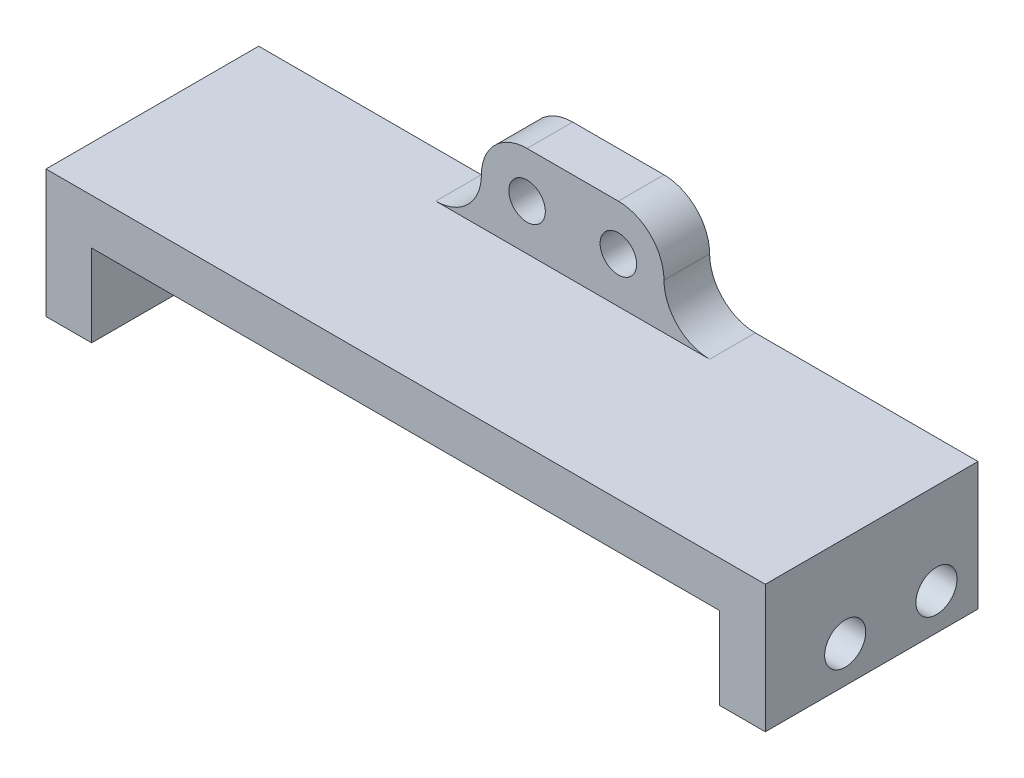
ISO-10303-21;
HEADER;
FILE_DESCRIPTION(('STEP AP214'),'2;1');
FILE_NAME('part.step','',(''),(''),'','','');
FILE_SCHEMA(('AUTOMOTIVE_DESIGN { 1 0 10303 214 1 1 1 1 }'));
ENDSEC;
DATA;
#1=APPLICATION_CONTEXT('core data for automotive mechanical design processes');
#2=APPLICATION_PROTOCOL_DEFINITION('international standard','automotive_design',2000,#1);
#3=PRODUCT_CONTEXT('',#1,'mechanical');
#4=PRODUCT('Part','Part','',(#3));
#5=PRODUCT_RELATED_PRODUCT_CATEGORY('part','',(#4));
#6=PRODUCT_DEFINITION_FORMATION('','',#4);
#7=PRODUCT_DEFINITION_CONTEXT('part definition',#1,'design');
#8=PRODUCT_DEFINITION('design','',#6,#7);
#9=PRODUCT_DEFINITION_SHAPE('','',#8);
#10=(LENGTH_UNIT() NAMED_UNIT(*) SI_UNIT(.MILLI.,.METRE.));
#11=(NAMED_UNIT(*) PLANE_ANGLE_UNIT() SI_UNIT($,.RADIAN.));
#12=(NAMED_UNIT(*) SI_UNIT($,.STERADIAN.) SOLID_ANGLE_UNIT());
#13=UNCERTAINTY_MEASURE_WITH_UNIT(LENGTH_MEASURE(1.E-05),#10,'distance_accuracy_value','');
#14=(GEOMETRIC_REPRESENTATION_CONTEXT(3) GLOBAL_UNCERTAINTY_ASSIGNED_CONTEXT((#13)) GLOBAL_UNIT_ASSIGNED_CONTEXT((#10,
#11,#12)) REPRESENTATION_CONTEXT('',''));
#15=CARTESIAN_POINT('',(0.,0.,0.));
#16=DIRECTION('',(0.,0.,1.));
#17=DIRECTION('',(1.,0.,0.));
#18=AXIS2_PLACEMENT_3D('',#15,#16,#17);
#19=CARTESIAN_POINT('',(-39.4,0.,23.3));
#20=DIRECTION('',(0.,-1.,0.));
#21=DIRECTION('',(0.,0.,-1.));
#22=AXIS2_PLACEMENT_3D('',#19,#20,#21);
#23=PLANE('',#22);
#24=DIRECTION('',(-1.,0.,0.));
#25=VECTOR('',#24,1.);
#26=CARTESIAN_POINT('',(10.,0.,5.));
#27=LINE('',#26,#25);
#28=CARTESIAN_POINT('',(15.,0.,5.));
#29=VERTEX_POINT('',#28);
#30=CARTESIAN_POINT('',(-15.,0.,5.));
#31=VERTEX_POINT('',#30);
#32=EDGE_CURVE('E235',#29,#31,#27,.T.);
#33=ORIENTED_EDGE('',*,*,#32,.T.);
#34=DIRECTION('',(0.,0.,-1.));
#35=VECTOR('',#34,1.);
#36=CARTESIAN_POINT('',(-15.,0.,23.3));
#37=LINE('',#36,#35);
#38=CARTESIAN_POINT('',(-15.,0.,0.));
#39=VERTEX_POINT('',#38);
#40=EDGE_CURVE('E164',#31,#39,#37,.T.);
#41=ORIENTED_EDGE('',*,*,#40,.T.);
#42=DIRECTION('',(-1.,0.,0.));
#43=VECTOR('',#42,1.);
#44=CARTESIAN_POINT('',(-39.4,0.,0.));
#45=LINE('',#44,#43);
#46=CARTESIAN_POINT('',(-39.4,0.,0.));
#47=VERTEX_POINT('',#46);
#48=EDGE_CURVE('E261',#39,#47,#45,.T.);
#49=ORIENTED_EDGE('',*,*,#48,.T.);
#50=DIRECTION('',(0.,0.,-1.));
#51=VECTOR('',#50,1.);
#52=CARTESIAN_POINT('',(-39.4,0.,23.3));
#53=LINE('',#52,#51);
#54=CARTESIAN_POINT('',(-39.4,0.,23.3));
#55=VERTEX_POINT('',#54);
#56=EDGE_CURVE('E267',#55,#47,#53,.T.);
#57=ORIENTED_EDGE('',*,*,#56,.F.);
#58=DIRECTION('',(-1.,0.,0.));
#59=VECTOR('',#58,1.);
#60=CARTESIAN_POINT('',(-39.4,0.,23.3));
#61=LINE('',#60,#59);
#62=CARTESIAN_POINT('',(39.4,0.,23.3));
#63=VERTEX_POINT('',#62);
#64=EDGE_CURVE('E246',#63,#55,#61,.T.);
#65=ORIENTED_EDGE('',*,*,#64,.F.);
#66=DIRECTION('',(0.,0.,-1.));
#67=VECTOR('',#66,1.);
#68=CARTESIAN_POINT('',(39.4,0.,23.3));
#69=LINE('',#68,#67);
#70=CARTESIAN_POINT('',(39.4,0.,0.));
#71=VERTEX_POINT('',#70);
#72=EDGE_CURVE('E270',#63,#71,#69,.T.);
#73=ORIENTED_EDGE('',*,*,#72,.T.);
#74=CARTESIAN_POINT('',(15.,0.,0.));
#75=VERTEX_POINT('',#74);
#76=EDGE_CURVE('E262',#71,#75,#45,.T.);
#77=ORIENTED_EDGE('',*,*,#76,.T.);
#78=DIRECTION('',(0.,0.,-1.));
#79=VECTOR('',#78,1.);
#80=CARTESIAN_POINT('',(15.,0.,23.3));
#81=LINE('',#80,#79);
#82=EDGE_CURVE('E161',#75,#29,#81,.F.);
#83=ORIENTED_EDGE('',*,*,#82,.T.);
#84=EDGE_LOOP('',(#33,#41,#49,#57,#65,#73,#77,#83));
#85=FACE_BOUND('',#84,.T.);
#86=ADVANCED_FACE('F34',(#85),#23,.F.);
#87=CARTESIAN_POINT('',(-39.4,-14.,23.3));
#88=DIRECTION('',(0.,1.,0.));
#89=DIRECTION('',(0.,0.,1.));
#90=AXIS2_PLACEMENT_3D('',#87,#88,#89);
#91=PLANE('',#90);
#92=DIRECTION('',(1.,0.,0.));
#93=VECTOR('',#92,1.);
#94=CARTESIAN_POINT('',(-39.4,-14.,0.));
#95=LINE('',#94,#93);
#96=CARTESIAN_POINT('',(-39.4,-14.,0.));
#97=VERTEX_POINT('',#96);
#98=CARTESIAN_POINT('',(-34.4,-14.,0.));
#99=VERTEX_POINT('',#98);
#100=EDGE_CURVE('E160',#97,#99,#95,.T.);
#101=ORIENTED_EDGE('',*,*,#100,.T.);
#102=DIRECTION('',(0.,0.,-1.));
#103=VECTOR('',#102,1.);
#104=CARTESIAN_POINT('',(-34.4,-14.,23.3));
#105=LINE('',#104,#103);
#106=CARTESIAN_POINT('',(-34.4,-14.,23.3));
#107=VERTEX_POINT('',#106);
#108=EDGE_CURVE('E140',#107,#99,#105,.T.);
#109=ORIENTED_EDGE('',*,*,#108,.F.);
#110=DIRECTION('',(1.,0.,0.));
#111=VECTOR('',#110,1.);
#112=CARTESIAN_POINT('',(-39.4,-14.,23.3));
#113=LINE('',#112,#111);
#114=CARTESIAN_POINT('',(-39.4,-14.,23.3));
#115=VERTEX_POINT('',#114);
#116=EDGE_CURVE('E147',#115,#107,#113,.T.);
#117=ORIENTED_EDGE('',*,*,#116,.F.);
#118=DIRECTION('',(0.,0.,-1.));
#119=VECTOR('',#118,1.);
#120=CARTESIAN_POINT('',(-39.4,-14.,23.3));
#121=LINE('',#120,#119);
#122=EDGE_CURVE('E249',#115,#97,#121,.T.);
#123=ORIENTED_EDGE('',*,*,#122,.T.);
#124=EDGE_LOOP('',(#101,#109,#117,#123));
#125=FACE_BOUND('',#124,.T.);
#126=ADVANCED_FACE('F158',(#125),#91,.F.);
#127=CARTESIAN_POINT('',(-34.4,-14.,23.3));
#128=DIRECTION('',(-1.,0.,0.));
#129=DIRECTION('',(0.,0.,1.));
#130=AXIS2_PLACEMENT_3D('',#127,#128,#129);
#131=PLANE('',#130);
#132=CARTESIAN_POINT('',(-34.4,-10.,4.55));
#133=DIRECTION('',(-1.,0.,0.));
#134=DIRECTION('',(0.,0.,1.));
#135=AXIS2_PLACEMENT_3D('',#132,#133,#134);
#136=CIRCLE('',#135,2.25);
#137=CARTESIAN_POINT('',(-34.4,-10.,6.8));
#138=VERTEX_POINT('',#137);
#139=EDGE_CURVE('E195',#138,#138,#136,.T.);
#140=ORIENTED_EDGE('',*,*,#139,.T.);
#141=EDGE_LOOP('',(#140));
#142=FACE_BOUND('',#141,.T.);
#143=CARTESIAN_POINT('',(-34.4,-10.,14.55));
#144=DIRECTION('',(-1.,0.,0.));
#145=DIRECTION('',(0.,0.,1.));
#146=AXIS2_PLACEMENT_3D('',#143,#144,#145);
#147=CIRCLE('',#146,2.25);
#148=CARTESIAN_POINT('',(-34.4,-10.,16.8));
#149=VERTEX_POINT('',#148);
#150=EDGE_CURVE('E203',#149,#149,#147,.T.);
#151=ORIENTED_EDGE('',*,*,#150,.T.);
#152=EDGE_LOOP('',(#151));
#153=FACE_BOUND('',#152,.T.);
#154=DIRECTION('',(0.,1.,0.));
#155=VECTOR('',#154,1.);
#156=CARTESIAN_POINT('',(-34.4,-14.,0.));
#157=LINE('',#156,#155);
#158=CARTESIAN_POINT('',(-34.4,-5.,0.));
#159=VERTEX_POINT('',#158);
#160=EDGE_CURVE('E251',#99,#159,#157,.T.);
#161=ORIENTED_EDGE('',*,*,#160,.T.);
#162=DIRECTION('',(0.,0.,-1.));
#163=VECTOR('',#162,1.);
#164=CARTESIAN_POINT('',(-34.4,-5.,23.3));
#165=LINE('',#164,#163);
#166=CARTESIAN_POINT('',(-34.4,-5.,23.3));
#167=VERTEX_POINT('',#166);
#168=EDGE_CURVE('E143',#167,#159,#165,.T.);
#169=ORIENTED_EDGE('',*,*,#168,.F.);
#170=DIRECTION('',(0.,1.,0.));
#171=VECTOR('',#170,1.);
#172=CARTESIAN_POINT('',(-34.4,-14.,23.3));
#173=LINE('',#172,#171);
#174=EDGE_CURVE('E136',#107,#167,#173,.T.);
#175=ORIENTED_EDGE('',*,*,#174,.F.);
#176=ORIENTED_EDGE('',*,*,#108,.T.);
#177=EDGE_LOOP('',(#161,#169,#175,#176));
#178=FACE_BOUND('',#177,.T.);
#179=ADVANCED_FACE('F138',(#142,#153,#178),#131,.F.);
#180=CARTESIAN_POINT('',(-34.4,-5.,23.3));
#181=DIRECTION('',(0.,1.,0.));
#182=DIRECTION('',(0.,0.,1.));
#183=AXIS2_PLACEMENT_3D('',#180,#181,#182);
#184=PLANE('',#183);
#185=DIRECTION('',(1.,0.,0.));
#186=VECTOR('',#185,1.);
#187=CARTESIAN_POINT('',(-34.4,-5.,0.));
#188=LINE('',#187,#186);
#189=CARTESIAN_POINT('',(34.4,-5.,0.));
#190=VERTEX_POINT('',#189);
#191=EDGE_CURVE('E253',#159,#190,#188,.T.);
#192=ORIENTED_EDGE('',*,*,#191,.T.);
#193=DIRECTION('',(0.,0.,-1.));
#194=VECTOR('',#193,1.);
#195=CARTESIAN_POINT('',(34.4,-5.,23.3));
#196=LINE('',#195,#194);
#197=CARTESIAN_POINT('',(34.4,-5.,23.3));
#198=VERTEX_POINT('',#197);
#199=EDGE_CURVE('E166',#198,#190,#196,.T.);
#200=ORIENTED_EDGE('',*,*,#199,.F.);
#201=DIRECTION('',(1.,0.,0.));
#202=VECTOR('',#201,1.);
#203=CARTESIAN_POINT('',(-34.4,-5.,23.3));
#204=LINE('',#203,#202);
#205=EDGE_CURVE('E146',#167,#198,#204,.T.);
#206=ORIENTED_EDGE('',*,*,#205,.F.);
#207=ORIENTED_EDGE('',*,*,#168,.T.);
#208=EDGE_LOOP('',(#192,#200,#206,#207));
#209=FACE_BOUND('',#208,.T.);
#210=ADVANCED_FACE('F304',(#209),#184,.F.);
#211=CARTESIAN_POINT('',(34.4,-5.,23.3));
#212=DIRECTION('',(1.,0.,0.));
#213=DIRECTION('',(0.,0.,-1.));
#214=AXIS2_PLACEMENT_3D('',#211,#212,#213);
#215=PLANE('',#214);
#216=CARTESIAN_POINT('',(34.4,-10.,4.55));
#217=DIRECTION('',(1.,0.,0.));
#218=DIRECTION('',(0.,0.,-1.));
#219=AXIS2_PLACEMENT_3D('',#216,#217,#218);
#220=CIRCLE('',#219,2.25);
#221=CARTESIAN_POINT('',(34.4,-10.,2.3));
#222=VERTEX_POINT('',#221);
#223=EDGE_CURVE('E215',#222,#222,#220,.T.);
#224=ORIENTED_EDGE('',*,*,#223,.T.);
#225=EDGE_LOOP('',(#224));
#226=FACE_BOUND('',#225,.T.);
#227=CARTESIAN_POINT('',(34.4,-10.,14.55));
#228=DIRECTION('',(1.,0.,0.));
#229=DIRECTION('',(0.,0.,-1.));
#230=AXIS2_PLACEMENT_3D('',#227,#228,#229);
#231=CIRCLE('',#230,2.25);
#232=CARTESIAN_POINT('',(34.4,-10.,12.3));
#233=VERTEX_POINT('',#232);
#234=EDGE_CURVE('E198',#233,#233,#231,.T.);
#235=ORIENTED_EDGE('',*,*,#234,.T.);
#236=EDGE_LOOP('',(#235));
#237=FACE_BOUND('',#236,.T.);
#238=DIRECTION('',(0.,-1.,0.));
#239=VECTOR('',#238,1.);
#240=CARTESIAN_POINT('',(34.4,-5.,0.));
#241=LINE('',#240,#239);
#242=CARTESIAN_POINT('',(34.4,-14.,0.));
#243=VERTEX_POINT('',#242);
#244=EDGE_CURVE('E255',#190,#243,#241,.T.);
#245=ORIENTED_EDGE('',*,*,#244,.T.);
#246=DIRECTION('',(0.,0.,-1.));
#247=VECTOR('',#246,1.);
#248=CARTESIAN_POINT('',(34.4,-14.,23.3));
#249=LINE('',#248,#247);
#250=CARTESIAN_POINT('',(34.4,-14.,23.3));
#251=VERTEX_POINT('',#250);
#252=EDGE_CURVE('E276',#251,#243,#249,.T.);
#253=ORIENTED_EDGE('',*,*,#252,.F.);
#254=DIRECTION('',(0.,-1.,0.));
#255=VECTOR('',#254,1.);
#256=CARTESIAN_POINT('',(34.4,-5.,23.3));
#257=LINE('',#256,#255);
#258=EDGE_CURVE('E240',#198,#251,#257,.T.);
#259=ORIENTED_EDGE('',*,*,#258,.F.);
#260=ORIENTED_EDGE('',*,*,#199,.T.);
#261=EDGE_LOOP('',(#245,#253,#259,#260));
#262=FACE_BOUND('',#261,.T.);
#263=ADVANCED_FACE('F283',(#226,#237,#262),#215,.F.);
#264=CARTESIAN_POINT('',(34.4,-14.,23.3));
#265=DIRECTION('',(0.,1.,0.));
#266=DIRECTION('',(0.,0.,1.));
#267=AXIS2_PLACEMENT_3D('',#264,#265,#266);
#268=PLANE('',#267);
#269=DIRECTION('',(1.,0.,0.));
#270=VECTOR('',#269,1.);
#271=CARTESIAN_POINT('',(34.4,-14.,0.));
#272=LINE('',#271,#270);
#273=CARTESIAN_POINT('',(39.4,-14.,0.));
#274=VERTEX_POINT('',#273);
#275=EDGE_CURVE('E257',#243,#274,#272,.T.);
#276=ORIENTED_EDGE('',*,*,#275,.T.);
#277=DIRECTION('',(0.,0.,-1.));
#278=VECTOR('',#277,1.);
#279=CARTESIAN_POINT('',(39.4,-14.,23.3));
#280=LINE('',#279,#278);
#281=CARTESIAN_POINT('',(39.4,-14.,23.3));
#282=VERTEX_POINT('',#281);
#283=EDGE_CURVE('E273',#282,#274,#280,.T.);
#284=ORIENTED_EDGE('',*,*,#283,.F.);
#285=DIRECTION('',(1.,0.,0.));
#286=VECTOR('',#285,1.);
#287=CARTESIAN_POINT('',(34.4,-14.,23.3));
#288=LINE('',#287,#286);
#289=EDGE_CURVE('E242',#251,#282,#288,.T.);
#290=ORIENTED_EDGE('',*,*,#289,.F.);
#291=ORIENTED_EDGE('',*,*,#252,.T.);
#292=EDGE_LOOP('',(#276,#284,#290,#291));
#293=FACE_BOUND('',#292,.T.);
#294=ADVANCED_FACE('F296',(#293),#268,.F.);
#295=CARTESIAN_POINT('',(39.4,0.,23.3));
#296=DIRECTION('',(-1.,0.,0.));
#297=DIRECTION('',(0.,0.,1.));
#298=AXIS2_PLACEMENT_3D('',#295,#296,#297);
#299=PLANE('',#298);
#300=CARTESIAN_POINT('',(39.4,-10.,4.55));
#301=DIRECTION('',(1.,0.,0.));
#302=DIRECTION('',(0.,0.,-1.));
#303=AXIS2_PLACEMENT_3D('',#300,#301,#302);
#304=CIRCLE('',#303,2.25);
#305=CARTESIAN_POINT('',(39.4,-10.,2.3));
#306=VERTEX_POINT('',#305);
#307=EDGE_CURVE('E199',#306,#306,#304,.T.);
#308=ORIENTED_EDGE('',*,*,#307,.F.);
#309=EDGE_LOOP('',(#308));
#310=FACE_BOUND('',#309,.T.);
#311=CARTESIAN_POINT('',(39.4,-10.,14.55));
#312=DIRECTION('',(1.,0.,0.));
#313=DIRECTION('',(0.,0.,-1.));
#314=AXIS2_PLACEMENT_3D('',#311,#312,#313);
#315=CIRCLE('',#314,2.25);
#316=CARTESIAN_POINT('',(39.4,-10.,12.3));
#317=VERTEX_POINT('',#316);
#318=EDGE_CURVE('E206',#317,#317,#315,.T.);
#319=ORIENTED_EDGE('',*,*,#318,.F.);
#320=EDGE_LOOP('',(#319));
#321=FACE_BOUND('',#320,.T.);
#322=DIRECTION('',(0.,1.,0.));
#323=VECTOR('',#322,1.);
#324=CARTESIAN_POINT('',(39.4,0.,0.));
#325=LINE('',#324,#323);
#326=EDGE_CURVE('E259',#274,#71,#325,.T.);
#327=ORIENTED_EDGE('',*,*,#326,.T.);
#328=ORIENTED_EDGE('',*,*,#72,.F.);
#329=DIRECTION('',(0.,1.,0.));
#330=VECTOR('',#329,1.);
#331=CARTESIAN_POINT('',(39.4,0.,23.3));
#332=LINE('',#331,#330);
#333=EDGE_CURVE('E244',#282,#63,#332,.T.);
#334=ORIENTED_EDGE('',*,*,#333,.F.);
#335=ORIENTED_EDGE('',*,*,#283,.T.);
#336=EDGE_LOOP('',(#327,#328,#334,#335));
#337=FACE_BOUND('',#336,.T.);
#338=ADVANCED_FACE('F300',(#310,#321,#337),#299,.F.);
#339=CARTESIAN_POINT('',(-39.4,-14.,23.3));
#340=DIRECTION('',(1.,0.,0.));
#341=DIRECTION('',(0.,0.,-1.));
#342=AXIS2_PLACEMENT_3D('',#339,#340,#341);
#343=PLANE('',#342);
#344=CARTESIAN_POINT('',(-39.4,-10.,4.55));
#345=DIRECTION('',(1.,0.,0.));
#346=DIRECTION('',(0.,0.,-1.));
#347=AXIS2_PLACEMENT_3D('',#344,#345,#346);
#348=CIRCLE('',#347,2.25);
#349=CARTESIAN_POINT('',(-39.4,-10.,2.3));
#350=VERTEX_POINT('',#349);
#351=EDGE_CURVE('E38',#350,#350,#348,.T.);
#352=ORIENTED_EDGE('',*,*,#351,.T.);
#353=EDGE_LOOP('',(#352));
#354=FACE_BOUND('',#353,.T.);
#355=CARTESIAN_POINT('',(-39.4,-10.,14.55));
#356=DIRECTION('',(1.,0.,0.));
#357=DIRECTION('',(0.,0.,-1.));
#358=AXIS2_PLACEMENT_3D('',#355,#356,#357);
#359=CIRCLE('',#358,2.25);
#360=CARTESIAN_POINT('',(-39.4,-10.,12.3));
#361=VERTEX_POINT('',#360);
#362=EDGE_CURVE('E196',#361,#361,#359,.T.);
#363=ORIENTED_EDGE('',*,*,#362,.T.);
#364=EDGE_LOOP('',(#363));
#365=FACE_BOUND('',#364,.T.);
#366=DIRECTION('',(0.,-1.,0.));
#367=VECTOR('',#366,1.);
#368=CARTESIAN_POINT('',(-39.4,-14.,0.));
#369=LINE('',#368,#367);
#370=EDGE_CURVE('E156',#47,#97,#369,.T.);
#371=ORIENTED_EDGE('',*,*,#370,.T.);
#372=ORIENTED_EDGE('',*,*,#122,.F.);
#373=DIRECTION('',(0.,-1.,0.));
#374=VECTOR('',#373,1.);
#375=CARTESIAN_POINT('',(-39.4,-14.,23.3));
#376=LINE('',#375,#374);
#377=EDGE_CURVE('E152',#55,#115,#376,.T.);
#378=ORIENTED_EDGE('',*,*,#377,.F.);
#379=ORIENTED_EDGE('',*,*,#56,.T.);
#380=EDGE_LOOP('',(#371,#372,#378,#379));
#381=FACE_BOUND('',#380,.T.);
#382=ADVANCED_FACE('F324',(#354,#365,#381),#343,.F.);
#383=CARTESIAN_POINT('',(0.,0.,23.3));
#384=DIRECTION('',(0.,0.,1.));
#385=DIRECTION('',(1.,0.,0.));
#386=AXIS2_PLACEMENT_3D('',#383,#384,#385);
#387=PLANE('',#386);
#388=ORIENTED_EDGE('',*,*,#116,.T.);
#389=ORIENTED_EDGE('',*,*,#174,.T.);
#390=ORIENTED_EDGE('',*,*,#205,.T.);
#391=ORIENTED_EDGE('',*,*,#258,.T.);
#392=ORIENTED_EDGE('',*,*,#289,.T.);
#393=ORIENTED_EDGE('',*,*,#333,.T.);
#394=ORIENTED_EDGE('',*,*,#64,.T.);
#395=ORIENTED_EDGE('',*,*,#377,.T.);
#396=EDGE_LOOP('',(#388,#389,#390,#391,#392,#393,#394,#395));
#397=FACE_BOUND('',#396,.T.);
#398=ADVANCED_FACE('F150',(#397),#387,.T.);
#399=CARTESIAN_POINT('',(0.,0.,0.));
#400=DIRECTION('',(0.,0.,1.));
#401=DIRECTION('',(1.,0.,0.));
#402=AXIS2_PLACEMENT_3D('',#399,#400,#401);
#403=PLANE('',#402);
#404=ORIENTED_EDGE('',*,*,#48,.F.);
#405=CARTESIAN_POINT('',(-15.,5.,0.));
#406=DIRECTION('',(0.,0.,1.));
#407=DIRECTION('',(1.,0.,0.));
#408=AXIS2_PLACEMENT_3D('',#405,#406,#407);
#409=CIRCLE('',#408,5.);
#410=CARTESIAN_POINT('',(-10.,5.,0.));
#411=VERTEX_POINT('',#410);
#412=EDGE_CURVE('E184',#39,#411,#409,.T.);
#413=ORIENTED_EDGE('',*,*,#412,.T.);
#414=CARTESIAN_POINT('',(-5.,5.,0.));
#415=DIRECTION('',(0.,0.,1.));
#416=DIRECTION('',(1.,0.,0.));
#417=AXIS2_PLACEMENT_3D('',#414,#415,#416);
#418=CIRCLE('',#417,5.);
#419=CARTESIAN_POINT('',(-5.,10.,0.));
#420=VERTEX_POINT('',#419);
#421=EDGE_CURVE('E174',#411,#420,#418,.F.);
#422=ORIENTED_EDGE('',*,*,#421,.T.);
#423=DIRECTION('',(1.,0.,0.));
#424=VECTOR('',#423,1.);
#425=CARTESIAN_POINT('',(10.,9.99999999999999,0.));
#426=LINE('',#425,#424);
#427=CARTESIAN_POINT('',(5.,10.,0.));
#428=VERTEX_POINT('',#427);
#429=EDGE_CURVE('E229',#420,#428,#426,.T.);
#430=ORIENTED_EDGE('',*,*,#429,.T.);
#431=CARTESIAN_POINT('',(5.,5.,0.));
#432=DIRECTION('',(0.,0.,1.));
#433=DIRECTION('',(1.,0.,0.));
#434=AXIS2_PLACEMENT_3D('',#431,#432,#433);
#435=CIRCLE('',#434,5.);
#436=CARTESIAN_POINT('',(10.,4.99999999999999,0.));
#437=VERTEX_POINT('',#436);
#438=EDGE_CURVE('E172',#428,#437,#435,.F.);
#439=ORIENTED_EDGE('',*,*,#438,.T.);
#440=CARTESIAN_POINT('',(15.,5.,0.));
#441=DIRECTION('',(0.,0.,1.));
#442=DIRECTION('',(1.,0.,0.));
#443=AXIS2_PLACEMENT_3D('',#440,#441,#442);
#444=CIRCLE('',#443,5.);
#445=EDGE_CURVE('E43',#437,#75,#444,.T.);
#446=ORIENTED_EDGE('',*,*,#445,.T.);
#447=ORIENTED_EDGE('',*,*,#76,.F.);
#448=ORIENTED_EDGE('',*,*,#326,.F.);
#449=ORIENTED_EDGE('',*,*,#275,.F.);
#450=ORIENTED_EDGE('',*,*,#244,.F.);
#451=ORIENTED_EDGE('',*,*,#191,.F.);
#452=ORIENTED_EDGE('',*,*,#160,.F.);
#453=ORIENTED_EDGE('',*,*,#100,.F.);
#454=ORIENTED_EDGE('',*,*,#370,.F.);
#455=EDGE_LOOP('',(#404,#413,#422,#430,#439,#446,#447,#448,#449,#450,#451,#452,#453,#454));
#456=FACE_BOUND('',#455,.T.);
#457=CARTESIAN_POINT('',(5.,4.99999999999999,0.));
#458=DIRECTION('',(0.,0.,-1.));
#459=DIRECTION('',(1.,0.,0.));
#460=AXIS2_PLACEMENT_3D('',#457,#458,#459);
#461=CIRCLE('',#460,2.);
#462=CARTESIAN_POINT('',(7.,4.99999999999999,0.));
#463=VERTEX_POINT('',#462);
#464=EDGE_CURVE('E192',#463,#463,#461,.T.);
#465=ORIENTED_EDGE('',*,*,#464,.F.);
#466=EDGE_LOOP('',(#465));
#467=FACE_BOUND('',#466,.T.);
#468=CARTESIAN_POINT('',(-5.,4.99999999999999,0.));
#469=DIRECTION('',(0.,0.,-1.));
#470=DIRECTION('',(-1.,0.,0.));
#471=AXIS2_PLACEMENT_3D('',#468,#469,#470);
#472=CIRCLE('',#471,2.);
#473=CARTESIAN_POINT('',(-7.,4.99999999999999,0.));
#474=VERTEX_POINT('',#473);
#475=EDGE_CURVE('E223',#474,#474,#472,.T.);
#476=ORIENTED_EDGE('',*,*,#475,.F.);
#477=EDGE_LOOP('',(#476));
#478=FACE_BOUND('',#477,.T.);
#479=ADVANCED_FACE('F290',(#456,#467,#478),#403,.F.);
#480=CARTESIAN_POINT('',(10.,9.99999999999999,5.));
#481=DIRECTION('',(0.,1.,0.));
#482=DIRECTION('',(-1.,0.,0.));
#483=AXIS2_PLACEMENT_3D('',#480,#481,#482);
#484=PLANE('',#483);
#485=ORIENTED_EDGE('',*,*,#429,.F.);
#486=DIRECTION('',(0.,0.,-1.));
#487=VECTOR('',#486,1.);
#488=CARTESIAN_POINT('',(-5.,10.,5.));
#489=LINE('',#488,#487);
#490=CARTESIAN_POINT('',(-5.,10.,5.));
#491=VERTEX_POINT('',#490);
#492=EDGE_CURVE('E179',#420,#491,#489,.F.);
#493=ORIENTED_EDGE('',*,*,#492,.T.);
#494=DIRECTION('',(1.,0.,0.));
#495=VECTOR('',#494,1.);
#496=CARTESIAN_POINT('',(10.,9.99999999999999,5.));
#497=LINE('',#496,#495);
#498=CARTESIAN_POINT('',(5.,10.,5.));
#499=VERTEX_POINT('',#498);
#500=EDGE_CURVE('E232',#491,#499,#497,.T.);
#501=ORIENTED_EDGE('',*,*,#500,.T.);
#502=DIRECTION('',(0.,0.,-1.));
#503=VECTOR('',#502,1.);
#504=CARTESIAN_POINT('',(5.,10.,5.));
#505=LINE('',#504,#503);
#506=EDGE_CURVE('E176',#499,#428,#505,.T.);
#507=ORIENTED_EDGE('',*,*,#506,.T.);
#508=EDGE_LOOP('',(#485,#493,#501,#507));
#509=FACE_BOUND('',#508,.T.);
#510=ADVANCED_FACE('F358',(#509),#484,.T.);
#511=CARTESIAN_POINT('',(0.,0.,5.));
#512=DIRECTION('',(0.,0.,-1.));
#513=DIRECTION('',(-1.,0.,0.));
#514=AXIS2_PLACEMENT_3D('',#511,#512,#513);
#515=PLANE('',#514);
#516=CARTESIAN_POINT('',(5.,4.99999999999999,5.));
#517=DIRECTION('',(0.,0.,-1.));
#518=DIRECTION('',(1.,0.,0.));
#519=AXIS2_PLACEMENT_3D('',#516,#517,#518);
#520=CIRCLE('',#519,2.);
#521=CARTESIAN_POINT('',(7.,4.99999999999999,5.));
#522=VERTEX_POINT('',#521);
#523=EDGE_CURVE('E220',#522,#522,#520,.T.);
#524=ORIENTED_EDGE('',*,*,#523,.T.);
#525=EDGE_LOOP('',(#524));
#526=FACE_BOUND('',#525,.T.);
#527=CARTESIAN_POINT('',(-5.,4.99999999999999,5.));
#528=DIRECTION('',(0.,0.,-1.));
#529=DIRECTION('',(-1.,0.,0.));
#530=AXIS2_PLACEMENT_3D('',#527,#528,#529);
#531=CIRCLE('',#530,2.);
#532=CARTESIAN_POINT('',(-7.,4.99999999999999,5.));
#533=VERTEX_POINT('',#532);
#534=EDGE_CURVE('E226',#533,#533,#531,.T.);
#535=ORIENTED_EDGE('',*,*,#534,.T.);
#536=EDGE_LOOP('',(#535));
#537=FACE_BOUND('',#536,.T.);
#538=ORIENTED_EDGE('',*,*,#500,.F.);
#539=CARTESIAN_POINT('',(-5.,5.,5.));
#540=DIRECTION('',(0.,0.,-1.));
#541=DIRECTION('',(-1.,0.,0.));
#542=AXIS2_PLACEMENT_3D('',#539,#540,#541);
#543=CIRCLE('',#542,5.);
#544=CARTESIAN_POINT('',(-10.,5.,5.));
#545=VERTEX_POINT('',#544);
#546=EDGE_CURVE('E56',#491,#545,#543,.F.);
#547=ORIENTED_EDGE('',*,*,#546,.T.);
#548=CARTESIAN_POINT('',(-15.,5.,5.));
#549=DIRECTION('',(0.,0.,-1.));
#550=DIRECTION('',(-1.,0.,0.));
#551=AXIS2_PLACEMENT_3D('',#548,#549,#550);
#552=CIRCLE('',#551,5.);
#553=EDGE_CURVE('E186',#545,#31,#552,.T.);
#554=ORIENTED_EDGE('',*,*,#553,.T.);
#555=ORIENTED_EDGE('',*,*,#32,.F.);
#556=CARTESIAN_POINT('',(15.,5.,5.));
#557=DIRECTION('',(0.,0.,-1.));
#558=DIRECTION('',(-1.,0.,0.));
#559=AXIS2_PLACEMENT_3D('',#556,#557,#558);
#560=CIRCLE('',#559,5.);
#561=CARTESIAN_POINT('',(10.,4.99999999999999,5.));
#562=VERTEX_POINT('',#561);
#563=EDGE_CURVE('E11',#29,#562,#560,.T.);
#564=ORIENTED_EDGE('',*,*,#563,.T.);
#565=CARTESIAN_POINT('',(5.,5.,5.));
#566=DIRECTION('',(0.,0.,-1.));
#567=DIRECTION('',(-1.,0.,0.));
#568=AXIS2_PLACEMENT_3D('',#565,#566,#567);
#569=CIRCLE('',#568,5.);
#570=EDGE_CURVE('E181',#562,#499,#569,.F.);
#571=ORIENTED_EDGE('',*,*,#570,.T.);
#572=EDGE_LOOP('',(#538,#547,#554,#555,#564,#571));
#573=FACE_BOUND('',#572,.T.);
#574=ADVANCED_FACE('F364',(#526,#537,#573),#515,.F.);
#575=CARTESIAN_POINT('',(-5.,4.99999999999999,5.));
#576=DIRECTION('',(0.,0.,-1.));
#577=DIRECTION('',(-1.,0.,0.));
#578=AXIS2_PLACEMENT_3D('',#575,#576,#577);
#579=CYLINDRICAL_SURFACE('',#578,2.);
#580=ORIENTED_EDGE('',*,*,#534,.F.);
#581=EDGE_LOOP('',(#580));
#582=FACE_BOUND('',#581,.T.);
#583=ORIENTED_EDGE('',*,*,#475,.T.);
#584=EDGE_LOOP('',(#583));
#585=FACE_BOUND('',#584,.T.);
#586=ADVANCED_FACE('F372',(#582,#585),#579,.F.);
#587=CARTESIAN_POINT('',(5.,4.99999999999999,5.));
#588=DIRECTION('',(0.,0.,-1.));
#589=DIRECTION('',(-1.,0.,0.));
#590=AXIS2_PLACEMENT_3D('',#587,#588,#589);
#591=CYLINDRICAL_SURFACE('',#590,2.);
#592=ORIENTED_EDGE('',*,*,#523,.F.);
#593=EDGE_LOOP('',(#592));
#594=FACE_BOUND('',#593,.T.);
#595=ORIENTED_EDGE('',*,*,#464,.T.);
#596=EDGE_LOOP('',(#595));
#597=FACE_BOUND('',#596,.T.);
#598=ADVANCED_FACE('F380',(#594,#597),#591,.F.);
#599=CARTESIAN_POINT('',(-5.,5.,5.));
#600=DIRECTION('',(0.,0.,-1.));
#601=DIRECTION('',(-1.,0.,0.));
#602=AXIS2_PLACEMENT_3D('',#599,#600,#601);
#603=CYLINDRICAL_SURFACE('',#602,5.);
#604=DIRECTION('',(0.,0.,-1.));
#605=VECTOR('',#604,1.);
#606=CARTESIAN_POINT('',(-10.,5.,5.));
#607=LINE('',#606,#605);
#608=EDGE_CURVE('E189',#545,#411,#607,.T.);
#609=ORIENTED_EDGE('',*,*,#608,.F.);
#610=ORIENTED_EDGE('',*,*,#546,.F.);
#611=ORIENTED_EDGE('',*,*,#492,.F.);
#612=ORIENTED_EDGE('',*,*,#421,.F.);
#613=EDGE_LOOP('',(#609,#610,#611,#612));
#614=FACE_BOUND('',#613,.T.);
#615=ADVANCED_FACE('F388',(#614),#603,.T.);
#616=CARTESIAN_POINT('',(-15.,5.,23.3));
#617=DIRECTION('',(0.,0.,-1.));
#618=DIRECTION('',(-1.,0.,0.));
#619=AXIS2_PLACEMENT_3D('',#616,#617,#618);
#620=CYLINDRICAL_SURFACE('',#619,5.);
#621=ORIENTED_EDGE('',*,*,#553,.F.);
#622=ORIENTED_EDGE('',*,*,#608,.T.);
#623=ORIENTED_EDGE('',*,*,#412,.F.);
#624=ORIENTED_EDGE('',*,*,#40,.F.);
#625=EDGE_LOOP('',(#621,#622,#623,#624));
#626=FACE_BOUND('',#625,.T.);
#627=ADVANCED_FACE('F395',(#626),#620,.F.);
#628=CARTESIAN_POINT('',(15.,5.,5.));
#629=DIRECTION('',(0.,0.,-1.));
#630=DIRECTION('',(-1.,0.,0.));
#631=AXIS2_PLACEMENT_3D('',#628,#629,#630);
#632=CYLINDRICAL_SURFACE('',#631,5.);
#633=DIRECTION('',(0.,0.,-1.));
#634=VECTOR('',#633,1.);
#635=CARTESIAN_POINT('',(10.,5.,5.));
#636=LINE('',#635,#634);
#637=EDGE_CURVE('E193',#562,#437,#636,.T.);
#638=ORIENTED_EDGE('',*,*,#637,.F.);
#639=ORIENTED_EDGE('',*,*,#563,.F.);
#640=ORIENTED_EDGE('',*,*,#82,.F.);
#641=ORIENTED_EDGE('',*,*,#445,.F.);
#642=EDGE_LOOP('',(#638,#639,#640,#641));
#643=FACE_BOUND('',#642,.T.);
#644=ADVANCED_FACE('F36',(#643),#632,.F.);
#645=CARTESIAN_POINT('',(5.,5.,5.));
#646=DIRECTION('',(0.,0.,-1.));
#647=DIRECTION('',(-1.,0.,0.));
#648=AXIS2_PLACEMENT_3D('',#645,#646,#647);
#649=CYLINDRICAL_SURFACE('',#648,5.);
#650=ORIENTED_EDGE('',*,*,#570,.F.);
#651=ORIENTED_EDGE('',*,*,#637,.T.);
#652=ORIENTED_EDGE('',*,*,#438,.F.);
#653=ORIENTED_EDGE('',*,*,#506,.F.);
#654=EDGE_LOOP('',(#650,#651,#652,#653));
#655=FACE_BOUND('',#654,.T.);
#656=ADVANCED_FACE('F410',(#655),#649,.T.);
#657=CARTESIAN_POINT('',(-84.6,-10.,14.55));
#658=DIRECTION('',(1.,0.,0.));
#659=DIRECTION('',(0.,0.,-1.));
#660=AXIS2_PLACEMENT_3D('',#657,#658,#659);
#661=CYLINDRICAL_SURFACE('',#660,2.25);
#662=ORIENTED_EDGE('',*,*,#362,.F.);
#663=EDGE_LOOP('',(#662));
#664=FACE_BOUND('',#663,.T.);
#665=ORIENTED_EDGE('',*,*,#150,.F.);
#666=EDGE_LOOP('',(#665));
#667=FACE_BOUND('',#666,.T.);
#668=ADVANCED_FACE('F417',(#664,#667),#661,.F.);
#669=CARTESIAN_POINT('',(-84.6,-10.,4.55));
#670=DIRECTION('',(1.,0.,0.));
#671=DIRECTION('',(0.,0.,-1.));
#672=AXIS2_PLACEMENT_3D('',#669,#670,#671);
#673=CYLINDRICAL_SURFACE('',#672,2.25);
#674=ORIENTED_EDGE('',*,*,#351,.F.);
#675=EDGE_LOOP('',(#674));
#676=FACE_BOUND('',#675,.T.);
#677=ORIENTED_EDGE('',*,*,#139,.F.);
#678=EDGE_LOOP('',(#677));
#679=FACE_BOUND('',#678,.T.);
#680=ADVANCED_FACE('F424',(#676,#679),#673,.F.);
#681=ORIENTED_EDGE('',*,*,#318,.T.);
#682=EDGE_LOOP('',(#681));
#683=FACE_BOUND('',#682,.T.);
#684=ORIENTED_EDGE('',*,*,#234,.F.);
#685=EDGE_LOOP('',(#684));
#686=FACE_BOUND('',#685,.T.);
#687=ADVANCED_FACE('F427',(#683,#686),#661,.F.);
#688=ORIENTED_EDGE('',*,*,#307,.T.);
#689=EDGE_LOOP('',(#688));
#690=FACE_BOUND('',#689,.T.);
#691=ORIENTED_EDGE('',*,*,#223,.F.);
#692=EDGE_LOOP('',(#691));
#693=FACE_BOUND('',#692,.T.);
#694=ADVANCED_FACE('F435',(#690,#693),#673,.F.);
#695=CLOSED_SHELL('',(#86,#126,#179,#210,#263,#294,#338,#382,#398,#479,#510,#574,#586,#598,#615,
#627,#644,#656,#668,#680,#687,#694));
#696=MANIFOLD_SOLID_BREP('B2',#695);
#697=ADVANCED_BREP_SHAPE_REPRESENTATION('',(#18,#696),#14);
#698=SHAPE_DEFINITION_REPRESENTATION(#9,#697);
ENDSEC;
END-ISO-10303-21;
